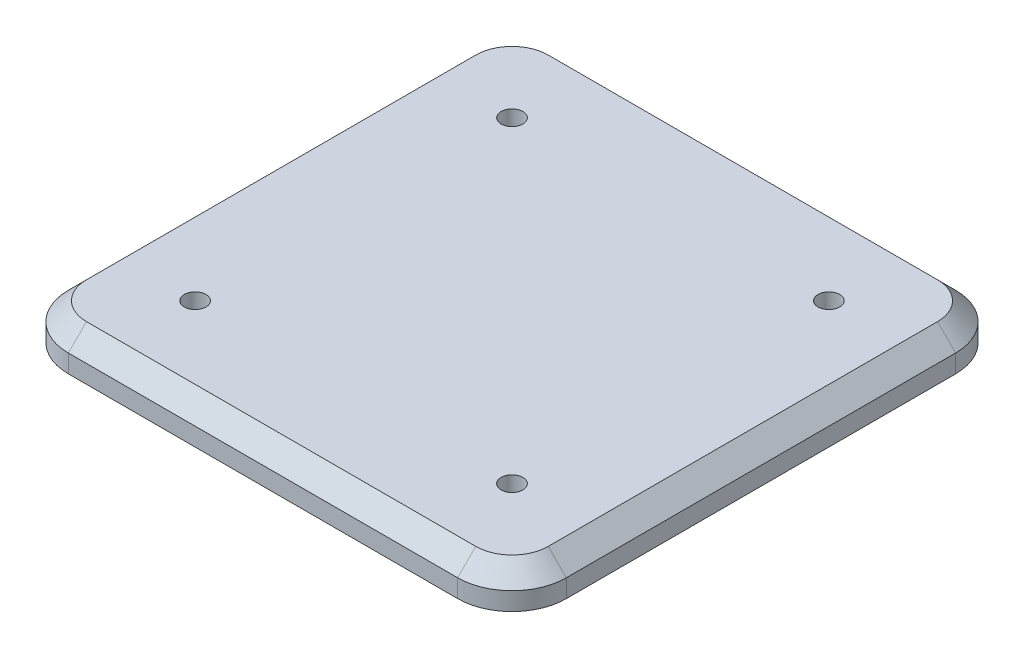
ISO-10303-21;
HEADER;
FILE_DESCRIPTION(('STEP AP214'),'2;1');
FILE_NAME('part.step','',(''),(''),'','','');
FILE_SCHEMA(('AUTOMOTIVE_DESIGN { 1 0 10303 214 1 1 1 1 }'));
ENDSEC;
DATA;
#1=APPLICATION_CONTEXT('core data for automotive mechanical design processes');
#2=APPLICATION_PROTOCOL_DEFINITION('international standard','automotive_design',2000,#1);
#3=PRODUCT_CONTEXT('',#1,'mechanical');
#4=PRODUCT('Part','Part','',(#3));
#5=PRODUCT_RELATED_PRODUCT_CATEGORY('part','',(#4));
#6=PRODUCT_DEFINITION_FORMATION('','',#4);
#7=PRODUCT_DEFINITION_CONTEXT('part definition',#1,'design');
#8=PRODUCT_DEFINITION('design','',#6,#7);
#9=PRODUCT_DEFINITION_SHAPE('','',#8);
#10=(LENGTH_UNIT() NAMED_UNIT(*) SI_UNIT(.MILLI.,.METRE.));
#11=(NAMED_UNIT(*) PLANE_ANGLE_UNIT() SI_UNIT($,.RADIAN.));
#12=(NAMED_UNIT(*) SI_UNIT($,.STERADIAN.) SOLID_ANGLE_UNIT());
#13=UNCERTAINTY_MEASURE_WITH_UNIT(LENGTH_MEASURE(1.E-05),#10,'distance_accuracy_value','');
#14=(GEOMETRIC_REPRESENTATION_CONTEXT(3) GLOBAL_UNCERTAINTY_ASSIGNED_CONTEXT((#13)) GLOBAL_UNIT_ASSIGNED_CONTEXT((#10,
#11,#12)) REPRESENTATION_CONTEXT('',''));
#15=CARTESIAN_POINT('',(0.,0.,0.));
#16=DIRECTION('',(0.,0.,1.));
#17=DIRECTION('',(1.,0.,0.));
#18=AXIS2_PLACEMENT_3D('',#15,#16,#17);
#19=CARTESIAN_POINT('',(-137.5,20.,137.5));
#20=DIRECTION('',(1.,0.,0.));
#21=DIRECTION('',(0.,0.,-1.));
#22=AXIS2_PLACEMENT_3D('',#19,#20,#21);
#23=PLANE('',#22);
#24=DIRECTION('',(0.,-1.,0.));
#25=VECTOR('',#24,1.);
#26=CARTESIAN_POINT('',(-137.5,20.,107.5));
#27=LINE('',#26,#25);
#28=CARTESIAN_POINT('',(-137.5,0.,107.5));
#29=VERTEX_POINT('',#28);
#30=CARTESIAN_POINT('',(-137.5,9.99999999999996,107.5));
#31=VERTEX_POINT('',#30);
#32=EDGE_CURVE('E238',#29,#31,#27,.F.);
#33=ORIENTED_EDGE('',*,*,#32,.T.);
#34=DIRECTION('',(0.,0.,-1.));
#35=VECTOR('',#34,1.);
#36=CARTESIAN_POINT('',(-137.5,9.99999999999996,137.5));
#37=LINE('',#36,#35);
#38=CARTESIAN_POINT('',(-137.5,9.99999999999996,-107.5));
#39=VERTEX_POINT('',#38);
#40=EDGE_CURVE('E42',#31,#39,#37,.T.);
#41=ORIENTED_EDGE('',*,*,#40,.T.);
#42=DIRECTION('',(0.,-1.,0.));
#43=VECTOR('',#42,1.);
#44=CARTESIAN_POINT('',(-137.5,20.,-107.5));
#45=LINE('',#44,#43);
#46=CARTESIAN_POINT('',(-137.5,0.,-107.5));
#47=VERTEX_POINT('',#46);
#48=EDGE_CURVE('E240',#39,#47,#45,.T.);
#49=ORIENTED_EDGE('',*,*,#48,.T.);
#50=DIRECTION('',(0.,0.,1.));
#51=VECTOR('',#50,1.);
#52=CARTESIAN_POINT('',(-137.5,0.,137.5));
#53=LINE('',#52,#51);
#54=EDGE_CURVE('E203',#47,#29,#53,.T.);
#55=ORIENTED_EDGE('',*,*,#54,.T.);
#56=EDGE_LOOP('',(#33,#41,#49,#55));
#57=FACE_BOUND('',#56,.T.);
#58=ADVANCED_FACE('F33',(#57),#23,.F.);
#59=CARTESIAN_POINT('',(137.5,20.,137.5));
#60=DIRECTION('',(0.,0.,-1.));
#61=DIRECTION('',(-1.,0.,0.));
#62=AXIS2_PLACEMENT_3D('',#59,#60,#61);
#63=PLANE('',#62);
#64=DIRECTION('',(0.,-1.,0.));
#65=VECTOR('',#64,1.);
#66=CARTESIAN_POINT('',(107.5,20.,137.5));
#67=LINE('',#66,#65);
#68=CARTESIAN_POINT('',(107.5,0.,137.5));
#69=VERTEX_POINT('',#68);
#70=CARTESIAN_POINT('',(107.5,9.99999999999996,137.5));
#71=VERTEX_POINT('',#70);
#72=EDGE_CURVE('E230',#69,#71,#67,.F.);
#73=ORIENTED_EDGE('',*,*,#72,.T.);
#74=DIRECTION('',(-1.,0.,0.));
#75=VECTOR('',#74,1.);
#76=CARTESIAN_POINT('',(137.5,9.99999999999996,137.5));
#77=LINE('',#76,#75);
#78=CARTESIAN_POINT('',(-107.5,9.99999999999996,137.5));
#79=VERTEX_POINT('',#78);
#80=EDGE_CURVE('E259',#71,#79,#77,.T.);
#81=ORIENTED_EDGE('',*,*,#80,.T.);
#82=DIRECTION('',(0.,-1.,0.));
#83=VECTOR('',#82,1.);
#84=CARTESIAN_POINT('',(-107.5,20.,137.5));
#85=LINE('',#84,#83);
#86=CARTESIAN_POINT('',(-107.5,0.,137.5));
#87=VERTEX_POINT('',#86);
#88=EDGE_CURVE('E228',#79,#87,#85,.T.);
#89=ORIENTED_EDGE('',*,*,#88,.T.);
#90=DIRECTION('',(1.,0.,0.));
#91=VECTOR('',#90,1.);
#92=CARTESIAN_POINT('',(137.5,0.,137.5));
#93=LINE('',#92,#91);
#94=EDGE_CURVE('E206',#87,#69,#93,.T.);
#95=ORIENTED_EDGE('',*,*,#94,.T.);
#96=EDGE_LOOP('',(#73,#81,#89,#95));
#97=FACE_BOUND('',#96,.T.);
#98=ADVANCED_FACE('F325',(#97),#63,.F.);
#99=CARTESIAN_POINT('',(137.5,20.,-137.5));
#100=DIRECTION('',(-1.,0.,0.));
#101=DIRECTION('',(0.,0.,1.));
#102=AXIS2_PLACEMENT_3D('',#99,#100,#101);
#103=PLANE('',#102);
#104=DIRECTION('',(0.,-1.,0.));
#105=VECTOR('',#104,1.);
#106=CARTESIAN_POINT('',(137.5,20.,-107.5));
#107=LINE('',#106,#105);
#108=CARTESIAN_POINT('',(137.5,0.,-107.5));
#109=VERTEX_POINT('',#108);
#110=CARTESIAN_POINT('',(137.5,9.99999999999996,-107.5));
#111=VERTEX_POINT('',#110);
#112=EDGE_CURVE('E215',#109,#111,#107,.F.);
#113=ORIENTED_EDGE('',*,*,#112,.T.);
#114=DIRECTION('',(0.,0.,1.));
#115=VECTOR('',#114,1.);
#116=CARTESIAN_POINT('',(137.5,9.99999999999996,-137.5));
#117=LINE('',#116,#115);
#118=CARTESIAN_POINT('',(137.5,9.99999999999996,107.5));
#119=VERTEX_POINT('',#118);
#120=EDGE_CURVE('E264',#111,#119,#117,.T.);
#121=ORIENTED_EDGE('',*,*,#120,.T.);
#122=DIRECTION('',(0.,-1.,0.));
#123=VECTOR('',#122,1.);
#124=CARTESIAN_POINT('',(137.5,20.,107.5));
#125=LINE('',#124,#123);
#126=CARTESIAN_POINT('',(137.5,0.,107.5));
#127=VERTEX_POINT('',#126);
#128=EDGE_CURVE('E218',#119,#127,#125,.T.);
#129=ORIENTED_EDGE('',*,*,#128,.T.);
#130=DIRECTION('',(0.,0.,-1.));
#131=VECTOR('',#130,1.);
#132=CARTESIAN_POINT('',(137.5,0.,-137.5));
#133=LINE('',#132,#131);
#134=EDGE_CURVE('E209',#127,#109,#133,.T.);
#135=ORIENTED_EDGE('',*,*,#134,.T.);
#136=EDGE_LOOP('',(#113,#121,#129,#135));
#137=FACE_BOUND('',#136,.T.);
#138=ADVANCED_FACE('F356',(#137),#103,.F.);
#139=CARTESIAN_POINT('',(-137.5,20.,-137.5));
#140=DIRECTION('',(0.,0.,1.));
#141=DIRECTION('',(1.,0.,0.));
#142=AXIS2_PLACEMENT_3D('',#139,#140,#141);
#143=PLANE('',#142);
#144=DIRECTION('',(0.,-1.,0.));
#145=VECTOR('',#144,1.);
#146=CARTESIAN_POINT('',(-107.5,20.,-137.5));
#147=LINE('',#146,#145);
#148=CARTESIAN_POINT('',(-107.5,0.,-137.5));
#149=VERTEX_POINT('',#148);
#150=CARTESIAN_POINT('',(-107.5,9.99999999999996,-137.5));
#151=VERTEX_POINT('',#150);
#152=EDGE_CURVE('E233',#149,#151,#147,.F.);
#153=ORIENTED_EDGE('',*,*,#152,.T.);
#154=DIRECTION('',(1.,0.,0.));
#155=VECTOR('',#154,1.);
#156=CARTESIAN_POINT('',(-137.5,9.99999999999996,-137.5));
#157=LINE('',#156,#155);
#158=CARTESIAN_POINT('',(107.5,9.99999999999996,-137.5));
#159=VERTEX_POINT('',#158);
#160=EDGE_CURVE('E268',#151,#159,#157,.T.);
#161=ORIENTED_EDGE('',*,*,#160,.T.);
#162=DIRECTION('',(0.,-1.,0.));
#163=VECTOR('',#162,1.);
#164=CARTESIAN_POINT('',(107.5,20.,-137.5));
#165=LINE('',#164,#163);
#166=CARTESIAN_POINT('',(107.5,0.,-137.5));
#167=VERTEX_POINT('',#166);
#168=EDGE_CURVE('E236',#159,#167,#165,.T.);
#169=ORIENTED_EDGE('',*,*,#168,.T.);
#170=DIRECTION('',(-1.,0.,0.));
#171=VECTOR('',#170,1.);
#172=CARTESIAN_POINT('',(-137.5,0.,-137.5));
#173=LINE('',#172,#171);
#174=EDGE_CURVE('E212',#167,#149,#173,.T.);
#175=ORIENTED_EDGE('',*,*,#174,.T.);
#176=EDGE_LOOP('',(#153,#161,#169,#175));
#177=FACE_BOUND('',#176,.T.);
#178=ADVANCED_FACE('F305',(#177),#143,.F.);
#179=CARTESIAN_POINT('',(0.,20.,0.));
#180=DIRECTION('',(0.,-1.,0.));
#181=DIRECTION('',(0.,0.,-1.));
#182=AXIS2_PLACEMENT_3D('',#179,#180,#181);
#183=PLANE('',#182);
#184=CARTESIAN_POINT('',(-87.5,20.,-87.5));
#185=DIRECTION('',(0.,1.,0.));
#186=DIRECTION('',(0.,0.,1.));
#187=AXIS2_PLACEMENT_3D('',#184,#185,#186);
#188=CIRCLE('',#187,6.00000000000001);
#189=CARTESIAN_POINT('',(-87.5,20.,-81.5));
#190=VERTEX_POINT('',#189);
#191=EDGE_CURVE('E156',#190,#190,#188,.T.);
#192=ORIENTED_EDGE('',*,*,#191,.F.);
#193=EDGE_LOOP('',(#192));
#194=FACE_BOUND('',#193,.T.);
#195=CARTESIAN_POINT('',(87.5,20.,-87.5));
#196=DIRECTION('',(0.,1.,0.));
#197=DIRECTION('',(0.,0.,1.));
#198=AXIS2_PLACEMENT_3D('',#195,#196,#197);
#199=CIRCLE('',#198,6.00000000000001);
#200=CARTESIAN_POINT('',(87.5,20.,-81.5));
#201=VERTEX_POINT('',#200);
#202=EDGE_CURVE('E155',#201,#201,#199,.T.);
#203=ORIENTED_EDGE('',*,*,#202,.F.);
#204=EDGE_LOOP('',(#203));
#205=FACE_BOUND('',#204,.T.);
#206=CARTESIAN_POINT('',(87.5,20.,87.5));
#207=DIRECTION('',(0.,1.,0.));
#208=DIRECTION('',(0.,0.,1.));
#209=AXIS2_PLACEMENT_3D('',#206,#207,#208);
#210=CIRCLE('',#209,6.00000000000001);
#211=CARTESIAN_POINT('',(87.5,20.,93.5));
#212=VERTEX_POINT('',#211);
#213=EDGE_CURVE('E166',#212,#212,#210,.T.);
#214=ORIENTED_EDGE('',*,*,#213,.F.);
#215=EDGE_LOOP('',(#214));
#216=FACE_BOUND('',#215,.T.);
#217=CARTESIAN_POINT('',(-87.5,20.,87.5));
#218=DIRECTION('',(0.,1.,0.));
#219=DIRECTION('',(0.,0.,1.));
#220=AXIS2_PLACEMENT_3D('',#217,#218,#219);
#221=CIRCLE('',#220,6.00000000000001);
#222=CARTESIAN_POINT('',(-87.5,20.,93.5));
#223=VERTEX_POINT('',#222);
#224=EDGE_CURVE('E172',#223,#223,#221,.T.);
#225=ORIENTED_EDGE('',*,*,#224,.F.);
#226=EDGE_LOOP('',(#225));
#227=FACE_BOUND('',#226,.T.);
#228=CARTESIAN_POINT('',(-107.5,20.,107.5));
#229=DIRECTION('',(0.,-1.,0.));
#230=DIRECTION('',(0.,0.,-1.));
#231=AXIS2_PLACEMENT_3D('',#228,#229,#230);
#232=CIRCLE('',#231,19.9999999999999);
#233=CARTESIAN_POINT('',(-127.5,20.,107.5));
#234=VERTEX_POINT('',#233);
#235=CARTESIAN_POINT('',(-107.5,20.,127.5));
#236=VERTEX_POINT('',#235);
#237=EDGE_CURVE('E242',#234,#236,#232,.F.);
#238=ORIENTED_EDGE('',*,*,#237,.T.);
#239=DIRECTION('',(1.,0.,0.));
#240=VECTOR('',#239,1.);
#241=CARTESIAN_POINT('',(0.,20.,127.5));
#242=LINE('',#241,#240);
#243=CARTESIAN_POINT('',(107.5,20.,127.5));
#244=VERTEX_POINT('',#243);
#245=EDGE_CURVE('E256',#236,#244,#242,.T.);
#246=ORIENTED_EDGE('',*,*,#245,.T.);
#247=CARTESIAN_POINT('',(107.5,20.,107.5));
#248=DIRECTION('',(0.,-1.,0.));
#249=DIRECTION('',(0.,0.,-1.));
#250=AXIS2_PLACEMENT_3D('',#247,#248,#249);
#251=CIRCLE('',#250,20.);
#252=CARTESIAN_POINT('',(127.5,20.,107.5));
#253=VERTEX_POINT('',#252);
#254=EDGE_CURVE('E254',#244,#253,#251,.F.);
#255=ORIENTED_EDGE('',*,*,#254,.T.);
#256=DIRECTION('',(0.,0.,-1.));
#257=VECTOR('',#256,1.);
#258=CARTESIAN_POINT('',(127.5,20.,0.));
#259=LINE('',#258,#257);
#260=CARTESIAN_POINT('',(127.5,20.,-107.5));
#261=VERTEX_POINT('',#260);
#262=EDGE_CURVE('E252',#253,#261,#259,.T.);
#263=ORIENTED_EDGE('',*,*,#262,.T.);
#264=CARTESIAN_POINT('',(107.5,20.,-107.5));
#265=DIRECTION('',(0.,-1.,0.));
#266=DIRECTION('',(0.,0.,-1.));
#267=AXIS2_PLACEMENT_3D('',#264,#265,#266);
#268=CIRCLE('',#267,20.);
#269=CARTESIAN_POINT('',(107.5,20.,-127.5));
#270=VERTEX_POINT('',#269);
#271=EDGE_CURVE('E250',#261,#270,#268,.F.);
#272=ORIENTED_EDGE('',*,*,#271,.T.);
#273=DIRECTION('',(-1.,0.,0.));
#274=VECTOR('',#273,1.);
#275=CARTESIAN_POINT('',(0.,20.,-127.5));
#276=LINE('',#275,#274);
#277=CARTESIAN_POINT('',(-107.5,20.,-127.5));
#278=VERTEX_POINT('',#277);
#279=EDGE_CURVE('E248',#270,#278,#276,.T.);
#280=ORIENTED_EDGE('',*,*,#279,.T.);
#281=CARTESIAN_POINT('',(-107.5,20.,-107.5));
#282=DIRECTION('',(0.,-1.,0.));
#283=DIRECTION('',(0.,0.,-1.));
#284=AXIS2_PLACEMENT_3D('',#281,#282,#283);
#285=CIRCLE('',#284,20.);
#286=CARTESIAN_POINT('',(-127.5,20.,-107.5));
#287=VERTEX_POINT('',#286);
#288=EDGE_CURVE('E246',#278,#287,#285,.F.);
#289=ORIENTED_EDGE('',*,*,#288,.T.);
#290=DIRECTION('',(0.,0.,1.));
#291=VECTOR('',#290,1.);
#292=CARTESIAN_POINT('',(-127.5,20.,0.));
#293=LINE('',#292,#291);
#294=EDGE_CURVE('E244',#287,#234,#293,.T.);
#295=ORIENTED_EDGE('',*,*,#294,.T.);
#296=EDGE_LOOP('',(#238,#246,#255,#263,#272,#280,#289,#295));
#297=FACE_BOUND('',#296,.T.);
#298=ADVANCED_FACE('F348',(#194,#205,#216,#227,#297),#183,.F.);
#299=CARTESIAN_POINT('',(0.,0.,0.));
#300=DIRECTION('',(0.,-1.,0.));
#301=DIRECTION('',(0.,0.,-1.));
#302=AXIS2_PLACEMENT_3D('',#299,#300,#301);
#303=PLANE('',#302);
#304=CARTESIAN_POINT('',(112.5,0.,112.5));
#305=DIRECTION('',(0.,-1.,0.));
#306=DIRECTION('',(0.,0.,-1.));
#307=AXIS2_PLACEMENT_3D('',#304,#305,#306);
#308=CIRCLE('',#307,6.00000000000001);
#309=CARTESIAN_POINT('',(112.5,0.,106.5));
#310=VERTEX_POINT('',#309);
#311=EDGE_CURVE('E178',#310,#310,#308,.T.);
#312=ORIENTED_EDGE('',*,*,#311,.F.);
#313=EDGE_LOOP('',(#312));
#314=FACE_BOUND('',#313,.T.);
#315=CARTESIAN_POINT('',(112.5,0.,-112.5));
#316=DIRECTION('',(0.,-1.,0.));
#317=DIRECTION('',(0.,0.,-1.));
#318=AXIS2_PLACEMENT_3D('',#315,#316,#317);
#319=CIRCLE('',#318,6.00000000000001);
#320=CARTESIAN_POINT('',(112.5,0.,-118.5));
#321=VERTEX_POINT('',#320);
#322=EDGE_CURVE('E184',#321,#321,#319,.T.);
#323=ORIENTED_EDGE('',*,*,#322,.F.);
#324=EDGE_LOOP('',(#323));
#325=FACE_BOUND('',#324,.T.);
#326=CARTESIAN_POINT('',(-112.5,0.,-112.5));
#327=DIRECTION('',(0.,-1.,0.));
#328=DIRECTION('',(0.,0.,-1.));
#329=AXIS2_PLACEMENT_3D('',#326,#327,#328);
#330=CIRCLE('',#329,6.00000000000001);
#331=CARTESIAN_POINT('',(-112.5,0.,-118.5));
#332=VERTEX_POINT('',#331);
#333=EDGE_CURVE('E190',#332,#332,#330,.T.);
#334=ORIENTED_EDGE('',*,*,#333,.F.);
#335=EDGE_LOOP('',(#334));
#336=FACE_BOUND('',#335,.T.);
#337=CARTESIAN_POINT('',(-112.5,0.,112.5));
#338=DIRECTION('',(0.,-1.,0.));
#339=DIRECTION('',(0.,0.,-1.));
#340=AXIS2_PLACEMENT_3D('',#337,#338,#339);
#341=CIRCLE('',#340,6.00000000000001);
#342=CARTESIAN_POINT('',(-112.5,0.,106.5));
#343=VERTEX_POINT('',#342);
#344=EDGE_CURVE('E196',#343,#343,#341,.T.);
#345=ORIENTED_EDGE('',*,*,#344,.F.);
#346=EDGE_LOOP('',(#345));
#347=FACE_BOUND('',#346,.T.);
#348=ORIENTED_EDGE('',*,*,#134,.F.);
#349=CARTESIAN_POINT('',(107.5,0.,107.5));
#350=DIRECTION('',(0.,-1.,0.));
#351=DIRECTION('',(0.,0.,-1.));
#352=AXIS2_PLACEMENT_3D('',#349,#350,#351);
#353=CIRCLE('',#352,30.);
#354=EDGE_CURVE('E226',#127,#69,#353,.T.);
#355=ORIENTED_EDGE('',*,*,#354,.T.);
#356=ORIENTED_EDGE('',*,*,#94,.F.);
#357=CARTESIAN_POINT('',(-107.5,0.,107.5));
#358=DIRECTION('',(0.,-1.,0.));
#359=DIRECTION('',(0.,0.,-1.));
#360=AXIS2_PLACEMENT_3D('',#357,#358,#359);
#361=CIRCLE('',#360,30.);
#362=EDGE_CURVE('E220',#87,#29,#361,.T.);
#363=ORIENTED_EDGE('',*,*,#362,.T.);
#364=ORIENTED_EDGE('',*,*,#54,.F.);
#365=CARTESIAN_POINT('',(-107.5,0.,-107.5));
#366=DIRECTION('',(0.,-1.,0.));
#367=DIRECTION('',(0.,0.,-1.));
#368=AXIS2_PLACEMENT_3D('',#365,#366,#367);
#369=CIRCLE('',#368,30.);
#370=EDGE_CURVE('E222',#47,#149,#369,.T.);
#371=ORIENTED_EDGE('',*,*,#370,.T.);
#372=ORIENTED_EDGE('',*,*,#174,.F.);
#373=CARTESIAN_POINT('',(107.5,0.,-107.5));
#374=DIRECTION('',(0.,-1.,0.));
#375=DIRECTION('',(0.,0.,-1.));
#376=AXIS2_PLACEMENT_3D('',#373,#374,#375);
#377=CIRCLE('',#376,30.);
#378=EDGE_CURVE('E224',#167,#109,#377,.T.);
#379=ORIENTED_EDGE('',*,*,#378,.T.);
#380=EDGE_LOOP('',(#348,#355,#356,#363,#364,#371,#372,#379));
#381=FACE_BOUND('',#380,.T.);
#382=ADVANCED_FACE('F314',(#314,#325,#336,#347,#381),#303,.T.);
#383=CARTESIAN_POINT('',(107.5,20.,107.5));
#384=DIRECTION('',(0.,-1.,0.));
#385=DIRECTION('',(0.,0.,-1.));
#386=AXIS2_PLACEMENT_3D('',#383,#384,#385);
#387=CYLINDRICAL_SURFACE('',#386,30.);
#388=ORIENTED_EDGE('',*,*,#128,.F.);
#389=CARTESIAN_POINT('',(107.5,9.99999999999996,107.5));
#390=DIRECTION('',(0.,-1.,0.));
#391=DIRECTION('',(0.,0.,-1.));
#392=AXIS2_PLACEMENT_3D('',#389,#390,#391);
#393=CIRCLE('',#392,30.);
#394=EDGE_CURVE('E262',#119,#71,#393,.T.);
#395=ORIENTED_EDGE('',*,*,#394,.T.);
#396=ORIENTED_EDGE('',*,*,#72,.F.);
#397=ORIENTED_EDGE('',*,*,#354,.F.);
#398=EDGE_LOOP('',(#388,#395,#396,#397));
#399=FACE_BOUND('',#398,.T.);
#400=ADVANCED_FACE('F329',(#399),#387,.T.);
#401=CARTESIAN_POINT('',(107.5,20.,-107.5));
#402=DIRECTION('',(0.,-1.,0.));
#403=DIRECTION('',(0.,0.,-1.));
#404=AXIS2_PLACEMENT_3D('',#401,#402,#403);
#405=CYLINDRICAL_SURFACE('',#404,30.);
#406=ORIENTED_EDGE('',*,*,#168,.F.);
#407=CARTESIAN_POINT('',(107.5,9.99999999999996,-107.5));
#408=DIRECTION('',(0.,-1.,0.));
#409=DIRECTION('',(0.,0.,-1.));
#410=AXIS2_PLACEMENT_3D('',#407,#408,#409);
#411=CIRCLE('',#410,30.);
#412=EDGE_CURVE('E266',#159,#111,#411,.T.);
#413=ORIENTED_EDGE('',*,*,#412,.T.);
#414=ORIENTED_EDGE('',*,*,#112,.F.);
#415=ORIENTED_EDGE('',*,*,#378,.F.);
#416=EDGE_LOOP('',(#406,#413,#414,#415));
#417=FACE_BOUND('',#416,.T.);
#418=ADVANCED_FACE('F309',(#417),#405,.T.);
#419=CARTESIAN_POINT('',(-107.5,20.,-107.5));
#420=DIRECTION('',(0.,-1.,0.));
#421=DIRECTION('',(0.,0.,-1.));
#422=AXIS2_PLACEMENT_3D('',#419,#420,#421);
#423=CYLINDRICAL_SURFACE('',#422,30.);
#424=ORIENTED_EDGE('',*,*,#48,.F.);
#425=CARTESIAN_POINT('',(-107.5,9.99999999999996,-107.5));
#426=DIRECTION('',(0.,-1.,0.));
#427=DIRECTION('',(0.,0.,-1.));
#428=AXIS2_PLACEMENT_3D('',#425,#426,#427);
#429=CIRCLE('',#428,30.);
#430=EDGE_CURVE('E270',#39,#151,#429,.T.);
#431=ORIENTED_EDGE('',*,*,#430,.T.);
#432=ORIENTED_EDGE('',*,*,#152,.F.);
#433=ORIENTED_EDGE('',*,*,#370,.F.);
#434=EDGE_LOOP('',(#424,#431,#432,#433));
#435=FACE_BOUND('',#434,.T.);
#436=ADVANCED_FACE('F318',(#435),#423,.T.);
#437=CARTESIAN_POINT('',(-107.5,20.,107.5));
#438=DIRECTION('',(0.,-1.,0.));
#439=DIRECTION('',(0.,0.,-1.));
#440=AXIS2_PLACEMENT_3D('',#437,#438,#439);
#441=CYLINDRICAL_SURFACE('',#440,30.);
#442=ORIENTED_EDGE('',*,*,#88,.F.);
#443=CARTESIAN_POINT('',(-107.5,9.99999999999996,107.5));
#444=DIRECTION('',(0.,-1.,0.));
#445=DIRECTION('',(0.,0.,-1.));
#446=AXIS2_PLACEMENT_3D('',#443,#444,#445);
#447=CIRCLE('',#446,30.);
#448=EDGE_CURVE('E11',#79,#31,#447,.T.);
#449=ORIENTED_EDGE('',*,*,#448,.T.);
#450=ORIENTED_EDGE('',*,*,#32,.F.);
#451=ORIENTED_EDGE('',*,*,#362,.F.);
#452=EDGE_LOOP('',(#442,#449,#450,#451));
#453=FACE_BOUND('',#452,.T.);
#454=ADVANCED_FACE('F320',(#453),#441,.T.);
#455=CARTESIAN_POINT('',(0.,20.,-127.5));
#456=DIRECTION('',(0.,-0.707106781186547,0.707106781186548));
#457=DIRECTION('',(-1.,0.,0.));
#458=AXIS2_PLACEMENT_3D('',#455,#456,#457);
#459=PLANE('',#458);
#460=DIRECTION('',(0.,0.707106781186549,0.707106781186546));
#461=VECTOR('',#460,1.);
#462=CARTESIAN_POINT('',(107.5,9.99999999999996,-137.5));
#463=LINE('',#462,#461);
#464=EDGE_CURVE('E287',#159,#270,#463,.T.);
#465=ORIENTED_EDGE('',*,*,#464,.F.);
#466=ORIENTED_EDGE('',*,*,#160,.F.);
#467=DIRECTION('',(0.,-0.707106781186549,-0.707106781186546));
#468=VECTOR('',#467,1.);
#469=CARTESIAN_POINT('',(-107.5,20.,-127.5));
#470=LINE('',#469,#468);
#471=EDGE_CURVE('E37',#278,#151,#470,.T.);
#472=ORIENTED_EDGE('',*,*,#471,.F.);
#473=ORIENTED_EDGE('',*,*,#279,.F.);
#474=EDGE_LOOP('',(#465,#466,#472,#473));
#475=FACE_BOUND('',#474,.T.);
#476=ADVANCED_FACE('F35',(#475),#459,.F.);
#477=CARTESIAN_POINT('',(-107.5,20.,-107.5));
#478=DIRECTION('',(0.,-1.,0.));
#479=DIRECTION('',(0.,0.,-1.));
#480=AXIS2_PLACEMENT_3D('',#477,#478,#479);
#481=CONICAL_SURFACE('',#480,20.,0.785398163397448);
#482=ORIENTED_EDGE('',*,*,#471,.T.);
#483=ORIENTED_EDGE('',*,*,#430,.F.);
#484=DIRECTION('',(-0.707106781186547,-0.707106781186548,0.));
#485=VECTOR('',#484,1.);
#486=CARTESIAN_POINT('',(-127.5,20.,-107.5));
#487=LINE('',#486,#485);
#488=EDGE_CURVE('E285',#287,#39,#487,.T.);
#489=ORIENTED_EDGE('',*,*,#488,.F.);
#490=ORIENTED_EDGE('',*,*,#288,.F.);
#491=EDGE_LOOP('',(#482,#483,#489,#490));
#492=FACE_BOUND('',#491,.T.);
#493=ADVANCED_FACE('F298',(#492),#481,.T.);
#494=CARTESIAN_POINT('',(107.5,20.,-107.5));
#495=DIRECTION('',(0.,-1.,0.));
#496=DIRECTION('',(0.,0.,-1.));
#497=AXIS2_PLACEMENT_3D('',#494,#495,#496);
#498=CONICAL_SURFACE('',#497,20.,0.785398163397448);
#499=ORIENTED_EDGE('',*,*,#464,.T.);
#500=ORIENTED_EDGE('',*,*,#271,.F.);
#501=DIRECTION('',(-0.707106781186547,0.707106781186548,0.));
#502=VECTOR('',#501,1.);
#503=CARTESIAN_POINT('',(137.5,9.99999999999996,-107.5));
#504=LINE('',#503,#502);
#505=EDGE_CURVE('E282',#111,#261,#504,.T.);
#506=ORIENTED_EDGE('',*,*,#505,.F.);
#507=ORIENTED_EDGE('',*,*,#412,.F.);
#508=EDGE_LOOP('',(#499,#500,#506,#507));
#509=FACE_BOUND('',#508,.T.);
#510=ADVANCED_FACE('F351',(#509),#498,.T.);
#511=CARTESIAN_POINT('',(-127.5,20.,0.));
#512=DIRECTION('',(0.707106781186547,-0.707106781186548,0.));
#513=DIRECTION('',(0.,0.,1.));
#514=AXIS2_PLACEMENT_3D('',#511,#512,#513);
#515=PLANE('',#514);
#516=ORIENTED_EDGE('',*,*,#488,.T.);
#517=ORIENTED_EDGE('',*,*,#40,.F.);
#518=DIRECTION('',(-0.707106781186547,-0.707106781186548,0.));
#519=VECTOR('',#518,1.);
#520=CARTESIAN_POINT('',(-127.5,20.,107.5));
#521=LINE('',#520,#519);
#522=EDGE_CURVE('E279',#234,#31,#521,.T.);
#523=ORIENTED_EDGE('',*,*,#522,.F.);
#524=ORIENTED_EDGE('',*,*,#294,.F.);
#525=EDGE_LOOP('',(#516,#517,#523,#524));
#526=FACE_BOUND('',#525,.T.);
#527=ADVANCED_FACE('F346',(#526),#515,.F.);
#528=CARTESIAN_POINT('',(127.5,20.,0.));
#529=DIRECTION('',(-0.707106781186547,-0.707106781186548,0.));
#530=DIRECTION('',(0.,0.,-1.));
#531=AXIS2_PLACEMENT_3D('',#528,#529,#530);
#532=PLANE('',#531);
#533=ORIENTED_EDGE('',*,*,#505,.T.);
#534=ORIENTED_EDGE('',*,*,#262,.F.);
#535=DIRECTION('',(-0.707106781186548,0.707106781186547,0.));
#536=VECTOR('',#535,1.);
#537=CARTESIAN_POINT('',(137.5,9.99999999999996,107.5));
#538=LINE('',#537,#536);
#539=EDGE_CURVE('E276',#119,#253,#538,.T.);
#540=ORIENTED_EDGE('',*,*,#539,.F.);
#541=ORIENTED_EDGE('',*,*,#120,.F.);
#542=EDGE_LOOP('',(#533,#534,#540,#541));
#543=FACE_BOUND('',#542,.T.);
#544=ADVANCED_FACE('F354',(#543),#532,.F.);
#545=CARTESIAN_POINT('',(-107.5,20.,107.5));
#546=DIRECTION('',(0.,-1.,0.));
#547=DIRECTION('',(0.,0.,-1.));
#548=AXIS2_PLACEMENT_3D('',#545,#546,#547);
#549=CONICAL_SURFACE('',#548,19.9999999999999,0.785398163397449);
#550=ORIENTED_EDGE('',*,*,#522,.T.);
#551=ORIENTED_EDGE('',*,*,#448,.F.);
#552=DIRECTION('',(0.,-0.707106781186547,0.707106781186548));
#553=VECTOR('',#552,1.);
#554=CARTESIAN_POINT('',(-107.5,20.,127.5));
#555=LINE('',#554,#553);
#556=EDGE_CURVE('E274',#236,#79,#555,.T.);
#557=ORIENTED_EDGE('',*,*,#556,.F.);
#558=ORIENTED_EDGE('',*,*,#237,.F.);
#559=EDGE_LOOP('',(#550,#551,#557,#558));
#560=FACE_BOUND('',#559,.T.);
#561=ADVANCED_FACE('F342',(#560),#549,.T.);
#562=CARTESIAN_POINT('',(107.5,20.,107.5));
#563=DIRECTION('',(0.,-1.,0.));
#564=DIRECTION('',(0.,0.,-1.));
#565=AXIS2_PLACEMENT_3D('',#562,#563,#564);
#566=CONICAL_SURFACE('',#565,20.,0.785398163397448);
#567=ORIENTED_EDGE('',*,*,#539,.T.);
#568=ORIENTED_EDGE('',*,*,#254,.F.);
#569=DIRECTION('',(0.,0.707106781186548,-0.707106781186547));
#570=VECTOR('',#569,1.);
#571=CARTESIAN_POINT('',(107.5,9.99999999999996,137.5));
#572=LINE('',#571,#570);
#573=EDGE_CURVE('E202',#71,#244,#572,.T.);
#574=ORIENTED_EDGE('',*,*,#573,.F.);
#575=ORIENTED_EDGE('',*,*,#394,.F.);
#576=EDGE_LOOP('',(#567,#568,#574,#575));
#577=FACE_BOUND('',#576,.T.);
#578=ADVANCED_FACE('F334',(#577),#566,.T.);
#579=CARTESIAN_POINT('',(0.,20.,127.5));
#580=DIRECTION('',(0.,-0.707106781186547,-0.707106781186548));
#581=DIRECTION('',(1.,0.,0.));
#582=AXIS2_PLACEMENT_3D('',#579,#580,#581);
#583=PLANE('',#582);
#584=ORIENTED_EDGE('',*,*,#556,.T.);
#585=ORIENTED_EDGE('',*,*,#80,.F.);
#586=ORIENTED_EDGE('',*,*,#573,.T.);
#587=ORIENTED_EDGE('',*,*,#245,.F.);
#588=EDGE_LOOP('',(#584,#585,#586,#587));
#589=FACE_BOUND('',#588,.T.);
#590=ADVANCED_FACE('F338',(#589),#583,.F.);
#591=CARTESIAN_POINT('',(-112.5,9.99999999999999,112.5));
#592=DIRECTION('',(0.,-1.,0.));
#593=DIRECTION('',(0.,0.,-1.));
#594=AXIS2_PLACEMENT_3D('',#591,#592,#593);
#595=CONICAL_SURFACE('',#594,6.00000000000001,1.02974425867666);
#596=CARTESIAN_POINT('',(-112.5,13.6051637141654,112.5));
#597=VERTEX_POINT('',#596);
#598=VERTEX_LOOP('',#597);
#599=FACE_BOUND('',#598,.T.);
#600=CARTESIAN_POINT('',(-112.5,9.99999999999999,112.5));
#601=DIRECTION('',(0.,-1.,0.));
#602=DIRECTION('',(0.,0.,-1.));
#603=AXIS2_PLACEMENT_3D('',#600,#601,#602);
#604=CIRCLE('',#603,6.00000000000001);
#605=CARTESIAN_POINT('',(-112.5,9.99999999999999,106.5));
#606=VERTEX_POINT('',#605);
#607=EDGE_CURVE('E199',#606,#606,#604,.T.);
#608=ORIENTED_EDGE('',*,*,#607,.T.);
#609=EDGE_LOOP('',(#608));
#610=FACE_BOUND('',#609,.T.);
#611=ADVANCED_FACE('F380',(#599,#610),#595,.F.);
#612=CARTESIAN_POINT('',(-112.5,0.,112.5));
#613=DIRECTION('',(0.,-1.,0.));
#614=DIRECTION('',(0.,0.,-1.));
#615=AXIS2_PLACEMENT_3D('',#612,#613,#614);
#616=CYLINDRICAL_SURFACE('',#615,6.00000000000001);
#617=ORIENTED_EDGE('',*,*,#607,.F.);
#618=EDGE_LOOP('',(#617));
#619=FACE_BOUND('',#618,.T.);
#620=ORIENTED_EDGE('',*,*,#344,.T.);
#621=EDGE_LOOP('',(#620));
#622=FACE_BOUND('',#621,.T.);
#623=ADVANCED_FACE('F504',(#619,#622),#616,.F.);
#624=CARTESIAN_POINT('',(-112.5,9.99999999999999,-112.5));
#625=DIRECTION('',(0.,-1.,0.));
#626=DIRECTION('',(0.,0.,-1.));
#627=AXIS2_PLACEMENT_3D('',#624,#625,#626);
#628=CONICAL_SURFACE('',#627,6.00000000000001,1.02974425867666);
#629=CARTESIAN_POINT('',(-112.5,13.6051637141654,-112.5));
#630=VERTEX_POINT('',#629);
#631=VERTEX_LOOP('',#630);
#632=FACE_BOUND('',#631,.T.);
#633=CARTESIAN_POINT('',(-112.5,9.99999999999999,-112.5));
#634=DIRECTION('',(0.,-1.,0.));
#635=DIRECTION('',(0.,0.,-1.));
#636=AXIS2_PLACEMENT_3D('',#633,#634,#635);
#637=CIRCLE('',#636,6.00000000000001);
#638=CARTESIAN_POINT('',(-112.5,9.99999999999999,-118.5));
#639=VERTEX_POINT('',#638);
#640=EDGE_CURVE('E193',#639,#639,#637,.T.);
#641=ORIENTED_EDGE('',*,*,#640,.T.);
#642=EDGE_LOOP('',(#641));
#643=FACE_BOUND('',#642,.T.);
#644=ADVANCED_FACE('F513',(#632,#643),#628,.F.);
#645=CARTESIAN_POINT('',(-112.5,0.,-112.5));
#646=DIRECTION('',(0.,-1.,0.));
#647=DIRECTION('',(0.,0.,-1.));
#648=AXIS2_PLACEMENT_3D('',#645,#646,#647);
#649=CYLINDRICAL_SURFACE('',#648,6.00000000000001);
#650=ORIENTED_EDGE('',*,*,#640,.F.);
#651=EDGE_LOOP('',(#650));
#652=FACE_BOUND('',#651,.T.);
#653=ORIENTED_EDGE('',*,*,#333,.T.);
#654=EDGE_LOOP('',(#653));
#655=FACE_BOUND('',#654,.T.);
#656=ADVANCED_FACE('F522',(#652,#655),#649,.F.);
#657=CARTESIAN_POINT('',(112.5,9.99999999999999,-112.5));
#658=DIRECTION('',(0.,-1.,0.));
#659=DIRECTION('',(0.,0.,-1.));
#660=AXIS2_PLACEMENT_3D('',#657,#658,#659);
#661=CONICAL_SURFACE('',#660,6.00000000000001,1.02974425867666);
#662=CARTESIAN_POINT('',(112.5,13.6051637141654,-112.5));
#663=VERTEX_POINT('',#662);
#664=VERTEX_LOOP('',#663);
#665=FACE_BOUND('',#664,.T.);
#666=CARTESIAN_POINT('',(112.5,9.99999999999999,-112.5));
#667=DIRECTION('',(0.,-1.,0.));
#668=DIRECTION('',(0.,0.,-1.));
#669=AXIS2_PLACEMENT_3D('',#666,#667,#668);
#670=CIRCLE('',#669,6.00000000000001);
#671=CARTESIAN_POINT('',(112.5,9.99999999999999,-118.5));
#672=VERTEX_POINT('',#671);
#673=EDGE_CURVE('E187',#672,#672,#670,.T.);
#674=ORIENTED_EDGE('',*,*,#673,.T.);
#675=EDGE_LOOP('',(#674));
#676=FACE_BOUND('',#675,.T.);
#677=ADVANCED_FACE('F531',(#665,#676),#661,.F.);
#678=CARTESIAN_POINT('',(112.5,0.,-112.5));
#679=DIRECTION('',(0.,-1.,0.));
#680=DIRECTION('',(0.,0.,-1.));
#681=AXIS2_PLACEMENT_3D('',#678,#679,#680);
#682=CYLINDRICAL_SURFACE('',#681,6.00000000000001);
#683=ORIENTED_EDGE('',*,*,#673,.F.);
#684=EDGE_LOOP('',(#683));
#685=FACE_BOUND('',#684,.T.);
#686=ORIENTED_EDGE('',*,*,#322,.T.);
#687=EDGE_LOOP('',(#686));
#688=FACE_BOUND('',#687,.T.);
#689=ADVANCED_FACE('F540',(#685,#688),#682,.F.);
#690=CARTESIAN_POINT('',(112.5,9.99999999999999,112.5));
#691=DIRECTION('',(0.,-1.,0.));
#692=DIRECTION('',(0.,0.,-1.));
#693=AXIS2_PLACEMENT_3D('',#690,#691,#692);
#694=CONICAL_SURFACE('',#693,6.00000000000001,1.02974425867666);
#695=CARTESIAN_POINT('',(112.5,13.6051637141654,112.5));
#696=VERTEX_POINT('',#695);
#697=VERTEX_LOOP('',#696);
#698=FACE_BOUND('',#697,.T.);
#699=CARTESIAN_POINT('',(112.5,9.99999999999999,112.5));
#700=DIRECTION('',(0.,-1.,0.));
#701=DIRECTION('',(0.,0.,-1.));
#702=AXIS2_PLACEMENT_3D('',#699,#700,#701);
#703=CIRCLE('',#702,6.00000000000001);
#704=CARTESIAN_POINT('',(112.5,9.99999999999999,106.5));
#705=VERTEX_POINT('',#704);
#706=EDGE_CURVE('E181',#705,#705,#703,.T.);
#707=ORIENTED_EDGE('',*,*,#706,.T.);
#708=EDGE_LOOP('',(#707));
#709=FACE_BOUND('',#708,.T.);
#710=ADVANCED_FACE('F549',(#698,#709),#694,.F.);
#711=CARTESIAN_POINT('',(112.5,0.,112.5));
#712=DIRECTION('',(0.,-1.,0.));
#713=DIRECTION('',(0.,0.,-1.));
#714=AXIS2_PLACEMENT_3D('',#711,#712,#713);
#715=CYLINDRICAL_SURFACE('',#714,6.00000000000001);
#716=ORIENTED_EDGE('',*,*,#706,.F.);
#717=EDGE_LOOP('',(#716));
#718=FACE_BOUND('',#717,.T.);
#719=ORIENTED_EDGE('',*,*,#311,.T.);
#720=EDGE_LOOP('',(#719));
#721=FACE_BOUND('',#720,.T.);
#722=ADVANCED_FACE('F558',(#718,#721),#715,.F.);
#723=CARTESIAN_POINT('',(-87.5,10.,87.5));
#724=DIRECTION('',(0.,1.,0.));
#725=DIRECTION('',(0.,0.,1.));
#726=AXIS2_PLACEMENT_3D('',#723,#724,#725);
#727=CONICAL_SURFACE('',#726,6.00000000000001,1.02974425867666);
#728=CARTESIAN_POINT('',(-87.5,6.39483628583465,87.5));
#729=VERTEX_POINT('',#728);
#730=VERTEX_LOOP('',#729);
#731=FACE_BOUND('',#730,.T.);
#732=CARTESIAN_POINT('',(-87.5,10.,87.5));
#733=DIRECTION('',(0.,1.,0.));
#734=DIRECTION('',(0.,0.,1.));
#735=AXIS2_PLACEMENT_3D('',#732,#733,#734);
#736=CIRCLE('',#735,6.00000000000001);
#737=CARTESIAN_POINT('',(-87.5,10.,93.5));
#738=VERTEX_POINT('',#737);
#739=EDGE_CURVE('E175',#738,#738,#736,.T.);
#740=ORIENTED_EDGE('',*,*,#739,.T.);
#741=EDGE_LOOP('',(#740));
#742=FACE_BOUND('',#741,.T.);
#743=ADVANCED_FACE('F566',(#731,#742),#727,.F.);
#744=CARTESIAN_POINT('',(-87.5,20.,87.5));
#745=DIRECTION('',(0.,1.,0.));
#746=DIRECTION('',(0.,0.,1.));
#747=AXIS2_PLACEMENT_3D('',#744,#745,#746);
#748=CYLINDRICAL_SURFACE('',#747,6.00000000000001);
#749=ORIENTED_EDGE('',*,*,#739,.F.);
#750=EDGE_LOOP('',(#749));
#751=FACE_BOUND('',#750,.T.);
#752=ORIENTED_EDGE('',*,*,#224,.T.);
#753=EDGE_LOOP('',(#752));
#754=FACE_BOUND('',#753,.T.);
#755=ADVANCED_FACE('F574',(#751,#754),#748,.F.);
#756=CARTESIAN_POINT('',(87.5,10.,87.5));
#757=DIRECTION('',(0.,1.,0.));
#758=DIRECTION('',(0.,0.,1.));
#759=AXIS2_PLACEMENT_3D('',#756,#757,#758);
#760=CONICAL_SURFACE('',#759,6.00000000000001,1.02974425867666);
#761=CARTESIAN_POINT('',(87.5,6.39483628583465,87.5));
#762=VERTEX_POINT('',#761);
#763=VERTEX_LOOP('',#762);
#764=FACE_BOUND('',#763,.T.);
#765=CARTESIAN_POINT('',(87.5,10.,87.5));
#766=DIRECTION('',(0.,1.,0.));
#767=DIRECTION('',(0.,0.,1.));
#768=AXIS2_PLACEMENT_3D('',#765,#766,#767);
#769=CIRCLE('',#768,6.00000000000001);
#770=CARTESIAN_POINT('',(87.5,10.,93.5));
#771=VERTEX_POINT('',#770);
#772=EDGE_CURVE('E169',#771,#771,#769,.T.);
#773=ORIENTED_EDGE('',*,*,#772,.T.);
#774=EDGE_LOOP('',(#773));
#775=FACE_BOUND('',#774,.T.);
#776=ADVANCED_FACE('F583',(#764,#775),#760,.F.);
#777=CARTESIAN_POINT('',(87.5,20.,87.5));
#778=DIRECTION('',(0.,1.,0.));
#779=DIRECTION('',(0.,0.,1.));
#780=AXIS2_PLACEMENT_3D('',#777,#778,#779);
#781=CYLINDRICAL_SURFACE('',#780,6.00000000000001);
#782=ORIENTED_EDGE('',*,*,#772,.F.);
#783=EDGE_LOOP('',(#782));
#784=FACE_BOUND('',#783,.T.);
#785=ORIENTED_EDGE('',*,*,#213,.T.);
#786=EDGE_LOOP('',(#785));
#787=FACE_BOUND('',#786,.T.);
#788=ADVANCED_FACE('F592',(#784,#787),#781,.F.);
#789=CARTESIAN_POINT('',(87.5,10.,-87.5));
#790=DIRECTION('',(0.,1.,0.));
#791=DIRECTION('',(0.,0.,1.));
#792=AXIS2_PLACEMENT_3D('',#789,#790,#791);
#793=CONICAL_SURFACE('',#792,6.00000000000001,1.02974425867666);
#794=CARTESIAN_POINT('',(87.5,6.39483628583465,-87.5));
#795=VERTEX_POINT('',#794);
#796=VERTEX_LOOP('',#795);
#797=FACE_BOUND('',#796,.T.);
#798=CARTESIAN_POINT('',(87.5,10.,-87.5));
#799=DIRECTION('',(0.,1.,0.));
#800=DIRECTION('',(0.,0.,1.));
#801=AXIS2_PLACEMENT_3D('',#798,#799,#800);
#802=CIRCLE('',#801,6.00000000000001);
#803=CARTESIAN_POINT('',(87.5,10.,-81.5));
#804=VERTEX_POINT('',#803);
#805=EDGE_CURVE('E159',#804,#804,#802,.T.);
#806=ORIENTED_EDGE('',*,*,#805,.T.);
#807=EDGE_LOOP('',(#806));
#808=FACE_BOUND('',#807,.T.);
#809=ADVANCED_FACE('F601',(#797,#808),#793,.F.);
#810=CARTESIAN_POINT('',(87.5,20.,-87.5));
#811=DIRECTION('',(0.,1.,0.));
#812=DIRECTION('',(0.,0.,1.));
#813=AXIS2_PLACEMENT_3D('',#810,#811,#812);
#814=CYLINDRICAL_SURFACE('',#813,6.00000000000001);
#815=ORIENTED_EDGE('',*,*,#805,.F.);
#816=EDGE_LOOP('',(#815));
#817=FACE_BOUND('',#816,.T.);
#818=ORIENTED_EDGE('',*,*,#202,.T.);
#819=EDGE_LOOP('',(#818));
#820=FACE_BOUND('',#819,.T.);
#821=ADVANCED_FACE('F149',(#817,#820),#814,.F.);
#822=CARTESIAN_POINT('',(-87.5,10.,-87.5));
#823=DIRECTION('',(0.,1.,0.));
#824=DIRECTION('',(0.,0.,1.));
#825=AXIS2_PLACEMENT_3D('',#822,#823,#824);
#826=CONICAL_SURFACE('',#825,6.00000000000001,1.02974425867666);
#827=CARTESIAN_POINT('',(-87.5,6.39483628583465,-87.5));
#828=VERTEX_POINT('',#827);
#829=VERTEX_LOOP('',#828);
#830=FACE_BOUND('',#829,.T.);
#831=CARTESIAN_POINT('',(-87.5,10.,-87.5));
#832=DIRECTION('',(0.,1.,0.));
#833=DIRECTION('',(0.,0.,1.));
#834=AXIS2_PLACEMENT_3D('',#831,#832,#833);
#835=CIRCLE('',#834,6.00000000000001);
#836=CARTESIAN_POINT('',(-87.5,10.,-81.5));
#837=VERTEX_POINT('',#836);
#838=EDGE_CURVE('E153',#837,#837,#835,.T.);
#839=ORIENTED_EDGE('',*,*,#838,.T.);
#840=EDGE_LOOP('',(#839));
#841=FACE_BOUND('',#840,.T.);
#842=ADVANCED_FACE('F145',(#830,#841),#826,.F.);
#843=CARTESIAN_POINT('',(-87.5,20.,-87.5));
#844=DIRECTION('',(0.,1.,0.));
#845=DIRECTION('',(0.,0.,1.));
#846=AXIS2_PLACEMENT_3D('',#843,#844,#845);
#847=CYLINDRICAL_SURFACE('',#846,6.00000000000001);
#848=ORIENTED_EDGE('',*,*,#838,.F.);
#849=EDGE_LOOP('',(#848));
#850=FACE_BOUND('',#849,.T.);
#851=ORIENTED_EDGE('',*,*,#191,.T.);
#852=EDGE_LOOP('',(#851));
#853=FACE_BOUND('',#852,.T.);
#854=ADVANCED_FACE('F148',(#850,#853),#847,.F.);
#855=CLOSED_SHELL('',(#58,#98,#138,#178,#298,#382,#400,#418,#436,#454,#476,#493,#510,#527,#544,
#561,#578,#590,#611,#623,#644,#656,#677,#689,#710,#722,#743,#755,#776,#788,#809,#821,#842,#854));
#856=MANIFOLD_SOLID_BREP('B2',#855);
#857=ADVANCED_BREP_SHAPE_REPRESENTATION('',(#18,#856),#14);
#858=SHAPE_DEFINITION_REPRESENTATION(#9,#857);
ENDSEC;
END-ISO-10303-21;
